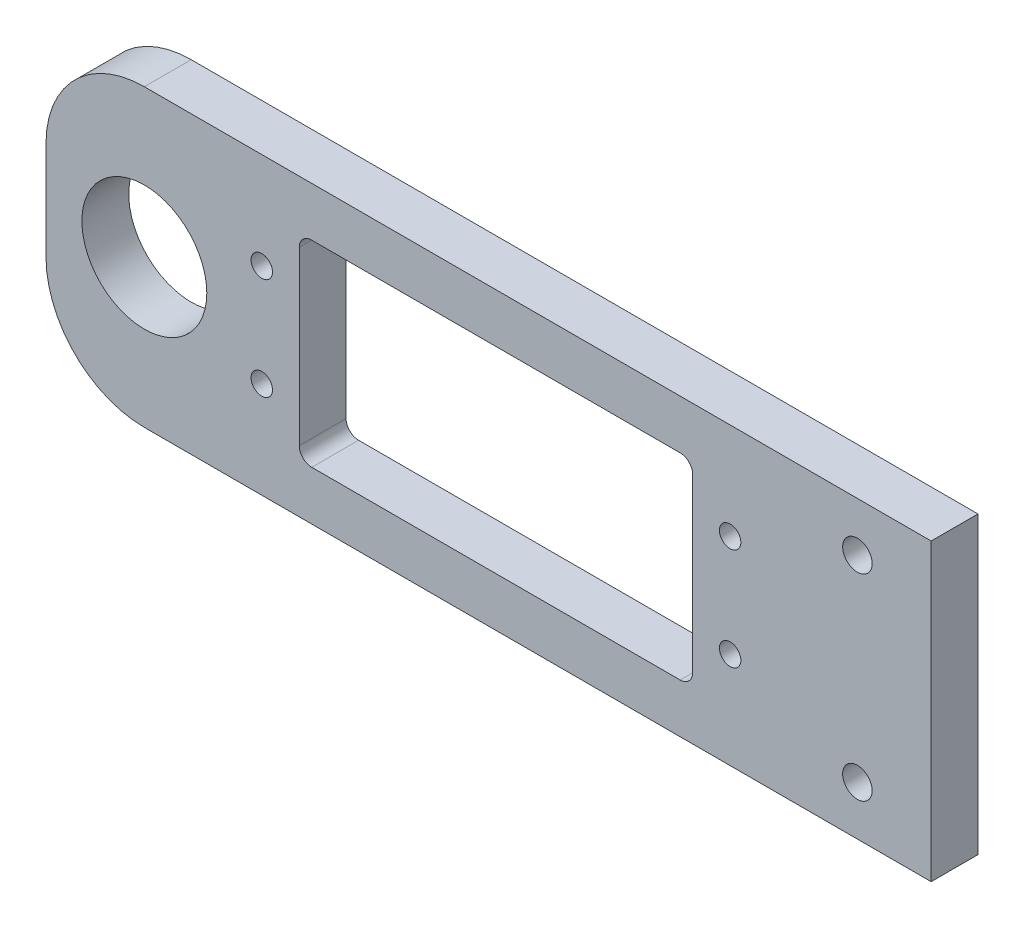
ISO-10303-21;
HEADER;
FILE_DESCRIPTION(('STEP AP214'),'2;1');
FILE_NAME('part.step','',(''),(''),'','','');
FILE_SCHEMA(('AUTOMOTIVE_DESIGN { 1 0 10303 214 1 1 1 1 }'));
ENDSEC;
DATA;
#1=APPLICATION_CONTEXT('core data for automotive mechanical design processes');
#2=APPLICATION_PROTOCOL_DEFINITION('international standard','automotive_design',2000,#1);
#3=PRODUCT_CONTEXT('',#1,'mechanical');
#4=PRODUCT('Part','Part','',(#3));
#5=PRODUCT_RELATED_PRODUCT_CATEGORY('part','',(#4));
#6=PRODUCT_DEFINITION_FORMATION('','',#4);
#7=PRODUCT_DEFINITION_CONTEXT('part definition',#1,'design');
#8=PRODUCT_DEFINITION('design','',#6,#7);
#9=PRODUCT_DEFINITION_SHAPE('','',#8);
#10=(LENGTH_UNIT() NAMED_UNIT(*) SI_UNIT(.MILLI.,.METRE.));
#11=(NAMED_UNIT(*) PLANE_ANGLE_UNIT() SI_UNIT($,.RADIAN.));
#12=(NAMED_UNIT(*) SI_UNIT($,.STERADIAN.) SOLID_ANGLE_UNIT());
#13=UNCERTAINTY_MEASURE_WITH_UNIT(LENGTH_MEASURE(1.E-05),#10,'distance_accuracy_value','');
#14=(GEOMETRIC_REPRESENTATION_CONTEXT(3) GLOBAL_UNCERTAINTY_ASSIGNED_CONTEXT((#13)) GLOBAL_UNIT_ASSIGNED_CONTEXT((#10,
#11,#12)) REPRESENTATION_CONTEXT('',''));
#15=CARTESIAN_POINT('',(0.,0.,0.));
#16=DIRECTION('',(0.,0.,1.));
#17=DIRECTION('',(1.,0.,0.));
#18=AXIS2_PLACEMENT_3D('',#15,#16,#17);
#19=CARTESIAN_POINT('',(45.,15.,4.7625));
#20=DIRECTION('',(-1.,0.,0.));
#21=DIRECTION('',(0.,-1.,0.));
#22=AXIS2_PLACEMENT_3D('',#19,#20,#21);
#23=PLANE('',#22);
#24=DIRECTION('',(0.,1.,0.));
#25=VECTOR('',#24,1.);
#26=CARTESIAN_POINT('',(45.,15.,0.));
#27=LINE('',#26,#25);
#28=CARTESIAN_POINT('',(45.,-15.,0.));
#29=VERTEX_POINT('',#28);
#30=CARTESIAN_POINT('',(45.,15.,0.));
#31=VERTEX_POINT('',#30);
#32=EDGE_CURVE('E159',#29,#31,#27,.T.);
#33=ORIENTED_EDGE('',*,*,#32,.T.);
#34=DIRECTION('',(0.,0.,-1.));
#35=VECTOR('',#34,1.);
#36=CARTESIAN_POINT('',(45.,15.,4.7625));
#37=LINE('',#36,#35);
#38=CARTESIAN_POINT('',(45.,15.,4.7625));
#39=VERTEX_POINT('',#38);
#40=EDGE_CURVE('E139',#39,#31,#37,.T.);
#41=ORIENTED_EDGE('',*,*,#40,.F.);
#42=DIRECTION('',(0.,1.,0.));
#43=VECTOR('',#42,1.);
#44=CARTESIAN_POINT('',(45.,15.,4.7625));
#45=LINE('',#44,#43);
#46=CARTESIAN_POINT('',(45.,-15.,4.7625));
#47=VERTEX_POINT('',#46);
#48=EDGE_CURVE('E146',#47,#39,#45,.T.);
#49=ORIENTED_EDGE('',*,*,#48,.F.);
#50=DIRECTION('',(0.,0.,-1.));
#51=VECTOR('',#50,1.);
#52=CARTESIAN_POINT('',(45.,-15.,4.7625));
#53=LINE('',#52,#51);
#54=EDGE_CURVE('E161',#47,#29,#53,.T.);
#55=ORIENTED_EDGE('',*,*,#54,.T.);
#56=EDGE_LOOP('',(#33,#41,#49,#55));
#57=FACE_BOUND('',#56,.T.);
#58=ADVANCED_FACE('F33',(#57),#23,.F.);
#59=CARTESIAN_POINT('',(-45.,15.,4.7625));
#60=DIRECTION('',(0.,-1.,0.));
#61=DIRECTION('',(0.,0.,-1.));
#62=AXIS2_PLACEMENT_3D('',#59,#60,#61);
#63=PLANE('',#62);
#64=DIRECTION('',(-1.,0.,0.));
#65=VECTOR('',#64,1.);
#66=CARTESIAN_POINT('',(-45.,15.,0.));
#67=LINE('',#66,#65);
#68=CARTESIAN_POINT('',(-35.,15.,0.));
#69=VERTEX_POINT('',#68);
#70=EDGE_CURVE('E304',#31,#69,#67,.T.);
#71=ORIENTED_EDGE('',*,*,#70,.T.);
#72=DIRECTION('',(0.,0.,-1.));
#73=VECTOR('',#72,1.);
#74=CARTESIAN_POINT('',(-35.,15.,4.7625));
#75=LINE('',#74,#73);
#76=CARTESIAN_POINT('',(-35.,15.,4.7625));
#77=VERTEX_POINT('',#76);
#78=EDGE_CURVE('E142',#69,#77,#75,.F.);
#79=ORIENTED_EDGE('',*,*,#78,.T.);
#80=DIRECTION('',(-1.,0.,0.));
#81=VECTOR('',#80,1.);
#82=CARTESIAN_POINT('',(-45.,15.,4.7625));
#83=LINE('',#82,#81);
#84=EDGE_CURVE('E134',#39,#77,#83,.T.);
#85=ORIENTED_EDGE('',*,*,#84,.F.);
#86=ORIENTED_EDGE('',*,*,#40,.T.);
#87=EDGE_LOOP('',(#71,#79,#85,#86));
#88=FACE_BOUND('',#87,.T.);
#89=ADVANCED_FACE('F137',(#88),#63,.F.);
#90=CARTESIAN_POINT('',(-45.,15.,4.7625));
#91=DIRECTION('',(1.,0.,0.));
#92=DIRECTION('',(0.,0.,-1.));
#93=AXIS2_PLACEMENT_3D('',#90,#91,#92);
#94=PLANE('',#93);
#95=DIRECTION('',(0.,-1.,0.));
#96=VECTOR('',#95,1.);
#97=CARTESIAN_POINT('',(-45.,15.,0.));
#98=LINE('',#97,#96);
#99=CARTESIAN_POINT('',(-45.,5.,0.));
#100=VERTEX_POINT('',#99);
#101=CARTESIAN_POINT('',(-45.,-5.,0.));
#102=VERTEX_POINT('',#101);
#103=EDGE_CURVE('E306',#100,#102,#98,.T.);
#104=ORIENTED_EDGE('',*,*,#103,.T.);
#105=DIRECTION('',(0.,0.,-1.));
#106=VECTOR('',#105,1.);
#107=CARTESIAN_POINT('',(-45.,-5.,4.7625));
#108=LINE('',#107,#106);
#109=CARTESIAN_POINT('',(-45.,-5.,4.7625));
#110=VERTEX_POINT('',#109);
#111=EDGE_CURVE('E175',#102,#110,#108,.F.);
#112=ORIENTED_EDGE('',*,*,#111,.T.);
#113=DIRECTION('',(0.,-1.,0.));
#114=VECTOR('',#113,1.);
#115=CARTESIAN_POINT('',(-45.,15.,4.7625));
#116=LINE('',#115,#114);
#117=CARTESIAN_POINT('',(-45.,5.,4.7625));
#118=VERTEX_POINT('',#117);
#119=EDGE_CURVE('E145',#118,#110,#116,.T.);
#120=ORIENTED_EDGE('',*,*,#119,.F.);
#121=DIRECTION('',(0.,0.,-1.));
#122=VECTOR('',#121,1.);
#123=CARTESIAN_POINT('',(-45.,5.,4.7625));
#124=LINE('',#123,#122);
#125=EDGE_CURVE('E172',#118,#100,#124,.T.);
#126=ORIENTED_EDGE('',*,*,#125,.T.);
#127=EDGE_LOOP('',(#104,#112,#120,#126));
#128=FACE_BOUND('',#127,.T.);
#129=ADVANCED_FACE('F248',(#128),#94,.F.);
#130=CARTESIAN_POINT('',(-45.,-15.,4.7625));
#131=DIRECTION('',(0.,1.,0.));
#132=DIRECTION('',(0.,0.,1.));
#133=AXIS2_PLACEMENT_3D('',#130,#131,#132);
#134=PLANE('',#133);
#135=DIRECTION('',(1.,0.,0.));
#136=VECTOR('',#135,1.);
#137=CARTESIAN_POINT('',(-45.,-15.,4.7625));
#138=LINE('',#137,#136);
#139=CARTESIAN_POINT('',(-35.,-15.,4.7625));
#140=VERTEX_POINT('',#139);
#141=EDGE_CURVE('E152',#140,#47,#138,.T.);
#142=ORIENTED_EDGE('',*,*,#141,.F.);
#143=DIRECTION('',(0.,0.,-1.));
#144=VECTOR('',#143,1.);
#145=CARTESIAN_POINT('',(-35.,-15.,4.7625));
#146=LINE('',#145,#144);
#147=CARTESIAN_POINT('',(-35.,-15.,0.));
#148=VERTEX_POINT('',#147);
#149=EDGE_CURVE('E160',#140,#148,#146,.T.);
#150=ORIENTED_EDGE('',*,*,#149,.T.);
#151=DIRECTION('',(1.,0.,0.));
#152=VECTOR('',#151,1.);
#153=CARTESIAN_POINT('',(-45.,-15.,0.));
#154=LINE('',#153,#152);
#155=EDGE_CURVE('E156',#148,#29,#154,.T.);
#156=ORIENTED_EDGE('',*,*,#155,.T.);
#157=ORIENTED_EDGE('',*,*,#54,.F.);
#158=EDGE_LOOP('',(#142,#150,#156,#157));
#159=FACE_BOUND('',#158,.T.);
#160=ADVANCED_FACE('F310',(#159),#134,.F.);
#161=CARTESIAN_POINT('',(0.,0.,4.7625));
#162=DIRECTION('',(0.,0.,1.));
#163=DIRECTION('',(1.,0.,0.));
#164=AXIS2_PLACEMENT_3D('',#161,#162,#163);
#165=PLANE('',#164);
#166=CARTESIAN_POINT('',(37.5,10.,4.7625));
#167=DIRECTION('',(0.,0.,1.));
#168=DIRECTION('',(1.,0.,0.));
#169=AXIS2_PLACEMENT_3D('',#166,#167,#168);
#170=CIRCLE('',#169,1.5);
#171=CARTESIAN_POINT('',(39.,10.,4.7625));
#172=VERTEX_POINT('',#171);
#173=EDGE_CURVE('E369',#172,#172,#170,.T.);
#174=ORIENTED_EDGE('',*,*,#173,.F.);
#175=EDGE_LOOP('',(#174));
#176=FACE_BOUND('',#175,.T.);
#177=CARTESIAN_POINT('',(37.5,-10.,4.7625));
#178=DIRECTION('',(0.,0.,1.));
#179=DIRECTION('',(-1.,0.,0.));
#180=AXIS2_PLACEMENT_3D('',#177,#178,#179);
#181=CIRCLE('',#180,1.5);
#182=CARTESIAN_POINT('',(36.,-10.,4.7625));
#183=VERTEX_POINT('',#182);
#184=EDGE_CURVE('E381',#183,#183,#181,.T.);
#185=ORIENTED_EDGE('',*,*,#184,.F.);
#186=EDGE_LOOP('',(#185));
#187=FACE_BOUND('',#186,.T.);
#188=CARTESIAN_POINT('',(24.56,5.19000000000001,4.7625));
#189=DIRECTION('',(0.,0.,1.));
#190=DIRECTION('',(-1.,0.,0.));
#191=AXIS2_PLACEMENT_3D('',#188,#189,#190);
#192=CIRCLE('',#191,1.09);
#193=CARTESIAN_POINT('',(23.47,5.19000000000001,4.7625));
#194=VERTEX_POINT('',#193);
#195=EDGE_CURVE('E373',#194,#194,#192,.T.);
#196=ORIENTED_EDGE('',*,*,#195,.F.);
#197=EDGE_LOOP('',(#196));
#198=FACE_BOUND('',#197,.T.);
#199=CARTESIAN_POINT('',(24.56,-5.19,4.7625));
#200=DIRECTION('',(0.,0.,1.));
#201=DIRECTION('',(1.,0.,0.));
#202=AXIS2_PLACEMENT_3D('',#199,#200,#201);
#203=CIRCLE('',#202,1.09);
#204=CARTESIAN_POINT('',(25.65,-5.19,4.7625));
#205=VERTEX_POINT('',#204);
#206=EDGE_CURVE('E393',#205,#205,#203,.T.);
#207=ORIENTED_EDGE('',*,*,#206,.F.);
#208=EDGE_LOOP('',(#207));
#209=FACE_BOUND('',#208,.T.);
#210=CARTESIAN_POINT('',(-23.06,-5.19,4.7625));
#211=DIRECTION('',(0.,0.,1.));
#212=DIRECTION('',(-1.,0.,0.));
#213=AXIS2_PLACEMENT_3D('',#210,#211,#212);
#214=CIRCLE('',#213,1.09);
#215=CARTESIAN_POINT('',(-24.15,-5.19,4.7625));
#216=VERTEX_POINT('',#215);
#217=EDGE_CURVE('E386',#216,#216,#214,.T.);
#218=ORIENTED_EDGE('',*,*,#217,.F.);
#219=EDGE_LOOP('',(#218));
#220=FACE_BOUND('',#219,.T.);
#221=CARTESIAN_POINT('',(-23.06,5.19,4.7625));
#222=DIRECTION('',(0.,0.,1.));
#223=DIRECTION('',(1.,0.,0.));
#224=AXIS2_PLACEMENT_3D('',#221,#222,#223);
#225=CIRCLE('',#224,1.09);
#226=CARTESIAN_POINT('',(-21.97,5.19,4.7625));
#227=VERTEX_POINT('',#226);
#228=EDGE_CURVE('E282',#227,#227,#225,.T.);
#229=ORIENTED_EDGE('',*,*,#228,.F.);
#230=EDGE_LOOP('',(#229));
#231=FACE_BOUND('',#230,.T.);
#232=DIRECTION('',(0.,-1.,0.));
#233=VECTOR('',#232,1.);
#234=CARTESIAN_POINT('',(-19.25,10.,4.7625));
#235=LINE('',#234,#233);
#236=CARTESIAN_POINT('',(-19.25,8.73,4.7625));
#237=VERTEX_POINT('',#236);
#238=CARTESIAN_POINT('',(-19.25,-8.73,4.7625));
#239=VERTEX_POINT('',#238);
#240=EDGE_CURVE('E288',#237,#239,#235,.T.);
#241=ORIENTED_EDGE('',*,*,#240,.F.);
#242=CARTESIAN_POINT('',(-17.98,8.73,4.7625));
#243=DIRECTION('',(0.,0.,1.));
#244=DIRECTION('',(1.,0.,0.));
#245=AXIS2_PLACEMENT_3D('',#242,#243,#244);
#246=CIRCLE('',#245,1.27);
#247=CARTESIAN_POINT('',(-17.98,10.,4.7625));
#248=VERTEX_POINT('',#247);
#249=EDGE_CURVE('E41',#237,#248,#246,.F.);
#250=ORIENTED_EDGE('',*,*,#249,.T.);
#251=DIRECTION('',(-1.,0.,0.));
#252=VECTOR('',#251,1.);
#253=CARTESIAN_POINT('',(-19.25,10.,4.7625));
#254=LINE('',#253,#252);
#255=CARTESIAN_POINT('',(19.48,10.,4.7625));
#256=VERTEX_POINT('',#255);
#257=EDGE_CURVE('E296',#256,#248,#254,.T.);
#258=ORIENTED_EDGE('',*,*,#257,.F.);
#259=CARTESIAN_POINT('',(19.48,8.73,4.7625));
#260=DIRECTION('',(0.,0.,1.));
#261=DIRECTION('',(1.,0.,0.));
#262=AXIS2_PLACEMENT_3D('',#259,#260,#261);
#263=CIRCLE('',#262,1.27);
#264=CARTESIAN_POINT('',(20.75,8.73,4.7625));
#265=VERTEX_POINT('',#264);
#266=EDGE_CURVE('E55',#256,#265,#263,.F.);
#267=ORIENTED_EDGE('',*,*,#266,.T.);
#268=DIRECTION('',(0.,1.,0.));
#269=VECTOR('',#268,1.);
#270=CARTESIAN_POINT('',(20.75,10.,4.7625));
#271=LINE('',#270,#269);
#272=CARTESIAN_POINT('',(20.75,-8.73,4.7625));
#273=VERTEX_POINT('',#272);
#274=EDGE_CURVE('E294',#273,#265,#271,.T.);
#275=ORIENTED_EDGE('',*,*,#274,.F.);
#276=CARTESIAN_POINT('',(19.48,-8.73,4.7625));
#277=DIRECTION('',(0.,0.,1.));
#278=DIRECTION('',(1.,0.,0.));
#279=AXIS2_PLACEMENT_3D('',#276,#277,#278);
#280=CIRCLE('',#279,1.27);
#281=CARTESIAN_POINT('',(19.48,-10.,4.7625));
#282=VERTEX_POINT('',#281);
#283=EDGE_CURVE('E205',#273,#282,#280,.F.);
#284=ORIENTED_EDGE('',*,*,#283,.T.);
#285=DIRECTION('',(1.,0.,0.));
#286=VECTOR('',#285,1.);
#287=CARTESIAN_POINT('',(-19.25,-10.,4.7625));
#288=LINE('',#287,#286);
#289=CARTESIAN_POINT('',(-17.98,-10.,4.7625));
#290=VERTEX_POINT('',#289);
#291=EDGE_CURVE('E291',#290,#282,#288,.T.);
#292=ORIENTED_EDGE('',*,*,#291,.F.);
#293=CARTESIAN_POINT('',(-17.98,-8.73,4.7625));
#294=DIRECTION('',(0.,0.,1.));
#295=DIRECTION('',(1.,0.,0.));
#296=AXIS2_PLACEMENT_3D('',#293,#294,#295);
#297=CIRCLE('',#296,1.27);
#298=EDGE_CURVE('E209',#290,#239,#297,.F.);
#299=ORIENTED_EDGE('',*,*,#298,.T.);
#300=EDGE_LOOP('',(#241,#250,#258,#267,#275,#284,#292,#299));
#301=FACE_BOUND('',#300,.T.);
#302=CARTESIAN_POINT('',(-35.,0.,4.7625));
#303=DIRECTION('',(0.,0.,1.));
#304=DIRECTION('',(1.,0.,0.));
#305=AXIS2_PLACEMENT_3D('',#302,#303,#304);
#306=CIRCLE('',#305,6.35);
#307=CARTESIAN_POINT('',(-28.65,0.,4.7625));
#308=VERTEX_POINT('',#307);
#309=EDGE_CURVE('E186',#308,#308,#306,.T.);
#310=ORIENTED_EDGE('',*,*,#309,.F.);
#311=EDGE_LOOP('',(#310));
#312=FACE_BOUND('',#311,.T.);
#313=ORIENTED_EDGE('',*,*,#119,.T.);
#314=CARTESIAN_POINT('',(-35.,-5.,4.7625));
#315=DIRECTION('',(0.,0.,1.));
#316=DIRECTION('',(1.,0.,0.));
#317=AXIS2_PLACEMENT_3D('',#314,#315,#316);
#318=CIRCLE('',#317,10.);
#319=EDGE_CURVE('E179',#110,#140,#318,.T.);
#320=ORIENTED_EDGE('',*,*,#319,.T.);
#321=ORIENTED_EDGE('',*,*,#141,.T.);
#322=ORIENTED_EDGE('',*,*,#48,.T.);
#323=ORIENTED_EDGE('',*,*,#84,.T.);
#324=CARTESIAN_POINT('',(-35.,5.,4.7625));
#325=DIRECTION('',(0.,0.,1.));
#326=DIRECTION('',(1.,0.,0.));
#327=AXIS2_PLACEMENT_3D('',#324,#325,#326);
#328=CIRCLE('',#327,10.);
#329=EDGE_CURVE('E177',#77,#118,#328,.T.);
#330=ORIENTED_EDGE('',*,*,#329,.T.);
#331=EDGE_LOOP('',(#313,#320,#321,#322,#323,#330));
#332=FACE_BOUND('',#331,.T.);
#333=ADVANCED_FACE('F150',(#176,#187,#198,#209,#220,#231,#301,#312,#332),#165,.T.);
#334=CARTESIAN_POINT('',(0.,0.,0.));
#335=DIRECTION('',(0.,0.,1.));
#336=DIRECTION('',(1.,0.,0.));
#337=AXIS2_PLACEMENT_3D('',#334,#335,#336);
#338=PLANE('',#337);
#339=CARTESIAN_POINT('',(37.5,10.,0.));
#340=DIRECTION('',(0.,0.,1.));
#341=DIRECTION('',(1.,0.,0.));
#342=AXIS2_PLACEMENT_3D('',#339,#340,#341);
#343=CIRCLE('',#342,1.5);
#344=CARTESIAN_POINT('',(39.,10.,0.));
#345=VERTEX_POINT('',#344);
#346=EDGE_CURVE('E372',#345,#345,#343,.F.);
#347=ORIENTED_EDGE('',*,*,#346,.F.);
#348=EDGE_LOOP('',(#347));
#349=FACE_BOUND('',#348,.T.);
#350=CARTESIAN_POINT('',(37.5,-10.,0.));
#351=DIRECTION('',(0.,0.,1.));
#352=DIRECTION('',(1.,0.,0.));
#353=AXIS2_PLACEMENT_3D('',#350,#351,#352);
#354=CIRCLE('',#353,1.5);
#355=CARTESIAN_POINT('',(39.,-10.,0.));
#356=VERTEX_POINT('',#355);
#357=EDGE_CURVE('E378',#356,#356,#354,.F.);
#358=ORIENTED_EDGE('',*,*,#357,.F.);
#359=EDGE_LOOP('',(#358));
#360=FACE_BOUND('',#359,.T.);
#361=CARTESIAN_POINT('',(24.56,5.19000000000001,0.));
#362=DIRECTION('',(0.,0.,1.));
#363=DIRECTION('',(1.,0.,0.));
#364=AXIS2_PLACEMENT_3D('',#361,#362,#363);
#365=CIRCLE('',#364,1.09);
#366=CARTESIAN_POINT('',(25.65,5.19000000000001,0.));
#367=VERTEX_POINT('',#366);
#368=EDGE_CURVE('E376',#367,#367,#365,.F.);
#369=ORIENTED_EDGE('',*,*,#368,.F.);
#370=EDGE_LOOP('',(#369));
#371=FACE_BOUND('',#370,.T.);
#372=CARTESIAN_POINT('',(24.56,-5.19,0.));
#373=DIRECTION('',(0.,0.,1.));
#374=DIRECTION('',(1.,0.,0.));
#375=AXIS2_PLACEMENT_3D('',#372,#373,#374);
#376=CIRCLE('',#375,1.09);
#377=CARTESIAN_POINT('',(25.65,-5.19,0.));
#378=VERTEX_POINT('',#377);
#379=EDGE_CURVE('E390',#378,#378,#376,.F.);
#380=ORIENTED_EDGE('',*,*,#379,.F.);
#381=EDGE_LOOP('',(#380));
#382=FACE_BOUND('',#381,.T.);
#383=CARTESIAN_POINT('',(-23.06,-5.19,0.));
#384=DIRECTION('',(0.,0.,1.));
#385=DIRECTION('',(1.,0.,0.));
#386=AXIS2_PLACEMENT_3D('',#383,#384,#385);
#387=CIRCLE('',#386,1.09);
#388=CARTESIAN_POINT('',(-21.97,-5.19,0.));
#389=VERTEX_POINT('',#388);
#390=EDGE_CURVE('E389',#389,#389,#387,.F.);
#391=ORIENTED_EDGE('',*,*,#390,.F.);
#392=EDGE_LOOP('',(#391));
#393=FACE_BOUND('',#392,.T.);
#394=CARTESIAN_POINT('',(-23.06,5.19,0.));
#395=DIRECTION('',(0.,0.,1.));
#396=DIRECTION('',(1.,0.,0.));
#397=AXIS2_PLACEMENT_3D('',#394,#395,#396);
#398=CIRCLE('',#397,1.09);
#399=CARTESIAN_POINT('',(-21.97,5.19,0.));
#400=VERTEX_POINT('',#399);
#401=EDGE_CURVE('E279',#400,#400,#398,.F.);
#402=ORIENTED_EDGE('',*,*,#401,.F.);
#403=EDGE_LOOP('',(#402));
#404=FACE_BOUND('',#403,.T.);
#405=DIRECTION('',(1.,0.,0.));
#406=VECTOR('',#405,1.);
#407=CARTESIAN_POINT('',(-19.25,10.,0.));
#408=LINE('',#407,#406);
#409=CARTESIAN_POINT('',(-17.98,10.,0.));
#410=VERTEX_POINT('',#409);
#411=CARTESIAN_POINT('',(19.48,10.,0.));
#412=VERTEX_POINT('',#411);
#413=EDGE_CURVE('E222',#410,#412,#408,.T.);
#414=ORIENTED_EDGE('',*,*,#413,.F.);
#415=CARTESIAN_POINT('',(-17.98,8.73,0.));
#416=DIRECTION('',(0.,0.,1.));
#417=DIRECTION('',(1.,0.,0.));
#418=AXIS2_PLACEMENT_3D('',#415,#416,#417);
#419=CIRCLE('',#418,1.27);
#420=CARTESIAN_POINT('',(-19.25,8.73,0.));
#421=VERTEX_POINT('',#420);
#422=EDGE_CURVE('E11',#410,#421,#419,.T.);
#423=ORIENTED_EDGE('',*,*,#422,.T.);
#424=DIRECTION('',(0.,1.,0.));
#425=VECTOR('',#424,1.);
#426=CARTESIAN_POINT('',(-19.25,10.,0.));
#427=LINE('',#426,#425);
#428=CARTESIAN_POINT('',(-19.25,-8.73,0.));
#429=VERTEX_POINT('',#428);
#430=EDGE_CURVE('E229',#429,#421,#427,.T.);
#431=ORIENTED_EDGE('',*,*,#430,.F.);
#432=CARTESIAN_POINT('',(-17.98,-8.73,0.));
#433=DIRECTION('',(0.,0.,1.));
#434=DIRECTION('',(1.,0.,0.));
#435=AXIS2_PLACEMENT_3D('',#432,#433,#434);
#436=CIRCLE('',#435,1.27);
#437=CARTESIAN_POINT('',(-17.98,-10.,0.));
#438=VERTEX_POINT('',#437);
#439=EDGE_CURVE('E211',#429,#438,#436,.T.);
#440=ORIENTED_EDGE('',*,*,#439,.T.);
#441=DIRECTION('',(-1.,0.,0.));
#442=VECTOR('',#441,1.);
#443=CARTESIAN_POINT('',(-19.25,-10.,0.));
#444=LINE('',#443,#442);
#445=CARTESIAN_POINT('',(19.48,-10.,0.));
#446=VERTEX_POINT('',#445);
#447=EDGE_CURVE('E275',#446,#438,#444,.T.);
#448=ORIENTED_EDGE('',*,*,#447,.F.);
#449=CARTESIAN_POINT('',(19.48,-8.73,0.));
#450=DIRECTION('',(0.,0.,1.));
#451=DIRECTION('',(1.,0.,0.));
#452=AXIS2_PLACEMENT_3D('',#449,#450,#451);
#453=CIRCLE('',#452,1.27);
#454=CARTESIAN_POINT('',(20.75,-8.73,0.));
#455=VERTEX_POINT('',#454);
#456=EDGE_CURVE('E207',#446,#455,#453,.T.);
#457=ORIENTED_EDGE('',*,*,#456,.T.);
#458=DIRECTION('',(0.,-1.,0.));
#459=VECTOR('',#458,1.);
#460=CARTESIAN_POINT('',(20.75,10.,0.));
#461=LINE('',#460,#459);
#462=CARTESIAN_POINT('',(20.75,8.73,0.));
#463=VERTEX_POINT('',#462);
#464=EDGE_CURVE('E225',#463,#455,#461,.T.);
#465=ORIENTED_EDGE('',*,*,#464,.F.);
#466=CARTESIAN_POINT('',(19.48,8.73,0.));
#467=DIRECTION('',(0.,0.,1.));
#468=DIRECTION('',(1.,0.,0.));
#469=AXIS2_PLACEMENT_3D('',#466,#467,#468);
#470=CIRCLE('',#469,1.27);
#471=EDGE_CURVE('E214',#463,#412,#470,.T.);
#472=ORIENTED_EDGE('',*,*,#471,.T.);
#473=EDGE_LOOP('',(#414,#423,#431,#440,#448,#457,#465,#472));
#474=FACE_BOUND('',#473,.T.);
#475=CARTESIAN_POINT('',(-35.,0.,0.));
#476=DIRECTION('',(0.,0.,1.));
#477=DIRECTION('',(1.,0.,0.));
#478=AXIS2_PLACEMENT_3D('',#475,#476,#477);
#479=CIRCLE('',#478,6.35);
#480=CARTESIAN_POINT('',(-28.65,0.,0.));
#481=VERTEX_POINT('',#480);
#482=EDGE_CURVE('E183',#481,#481,#479,.T.);
#483=ORIENTED_EDGE('',*,*,#482,.T.);
#484=EDGE_LOOP('',(#483));
#485=FACE_BOUND('',#484,.T.);
#486=ORIENTED_EDGE('',*,*,#155,.F.);
#487=CARTESIAN_POINT('',(-35.,-5.,0.));
#488=DIRECTION('',(0.,0.,1.));
#489=DIRECTION('',(1.,0.,0.));
#490=AXIS2_PLACEMENT_3D('',#487,#488,#489);
#491=CIRCLE('',#490,10.);
#492=EDGE_CURVE('E170',#148,#102,#491,.F.);
#493=ORIENTED_EDGE('',*,*,#492,.T.);
#494=ORIENTED_EDGE('',*,*,#103,.F.);
#495=CARTESIAN_POINT('',(-35.,5.,0.));
#496=DIRECTION('',(0.,0.,1.));
#497=DIRECTION('',(1.,0.,0.));
#498=AXIS2_PLACEMENT_3D('',#495,#496,#497);
#499=CIRCLE('',#498,10.);
#500=EDGE_CURVE('E164',#100,#69,#499,.F.);
#501=ORIENTED_EDGE('',*,*,#500,.T.);
#502=ORIENTED_EDGE('',*,*,#70,.F.);
#503=ORIENTED_EDGE('',*,*,#32,.F.);
#504=EDGE_LOOP('',(#486,#493,#494,#501,#502,#503));
#505=FACE_BOUND('',#504,.T.);
#506=ADVANCED_FACE('F220',(#349,#360,#371,#382,#393,#404,#474,#485,#505),#338,.F.);
#507=CARTESIAN_POINT('',(-35.,-5.,4.7625));
#508=DIRECTION('',(0.,0.,-1.));
#509=DIRECTION('',(-1.,0.,0.));
#510=AXIS2_PLACEMENT_3D('',#507,#508,#509);
#511=CYLINDRICAL_SURFACE('',#510,10.);
#512=ORIENTED_EDGE('',*,*,#319,.F.);
#513=ORIENTED_EDGE('',*,*,#111,.F.);
#514=ORIENTED_EDGE('',*,*,#492,.F.);
#515=ORIENTED_EDGE('',*,*,#149,.F.);
#516=EDGE_LOOP('',(#512,#513,#514,#515));
#517=FACE_BOUND('',#516,.T.);
#518=ADVANCED_FACE('F252',(#517),#511,.T.);
#519=CARTESIAN_POINT('',(-35.,5.,4.7625));
#520=DIRECTION('',(0.,0.,-1.));
#521=DIRECTION('',(-1.,0.,0.));
#522=AXIS2_PLACEMENT_3D('',#519,#520,#521);
#523=CYLINDRICAL_SURFACE('',#522,10.);
#524=ORIENTED_EDGE('',*,*,#329,.F.);
#525=ORIENTED_EDGE('',*,*,#78,.F.);
#526=ORIENTED_EDGE('',*,*,#500,.F.);
#527=ORIENTED_EDGE('',*,*,#125,.F.);
#528=EDGE_LOOP('',(#524,#525,#526,#527));
#529=FACE_BOUND('',#528,.T.);
#530=ADVANCED_FACE('F255',(#529),#523,.T.);
#531=CARTESIAN_POINT('',(-35.,0.,-1.2375));
#532=DIRECTION('',(0.,0.,1.));
#533=DIRECTION('',(1.,0.,0.));
#534=AXIS2_PLACEMENT_3D('',#531,#532,#533);
#535=CYLINDRICAL_SURFACE('',#534,6.35);
#536=ORIENTED_EDGE('',*,*,#309,.T.);
#537=EDGE_LOOP('',(#536));
#538=FACE_BOUND('',#537,.T.);
#539=ORIENTED_EDGE('',*,*,#482,.F.);
#540=EDGE_LOOP('',(#539));
#541=FACE_BOUND('',#540,.T.);
#542=ADVANCED_FACE('F259',(#538,#541),#535,.F.);
#543=CARTESIAN_POINT('',(-19.25,10.,-0.00100000000000013));
#544=DIRECTION('',(-1.,0.,0.));
#545=DIRECTION('',(0.,0.,1.));
#546=AXIS2_PLACEMENT_3D('',#543,#544,#545);
#547=PLANE('',#546);
#548=ORIENTED_EDGE('',*,*,#240,.T.);
#549=DIRECTION('',(0.,0.,1.));
#550=VECTOR('',#549,1.);
#551=CARTESIAN_POINT('',(-19.25,-8.73,0.));
#552=LINE('',#551,#550);
#553=EDGE_CURVE('E199',#239,#429,#552,.F.);
#554=ORIENTED_EDGE('',*,*,#553,.T.);
#555=ORIENTED_EDGE('',*,*,#430,.T.);
#556=DIRECTION('',(0.,0.,1.));
#557=VECTOR('',#556,1.);
#558=CARTESIAN_POINT('',(-19.25,8.73,4.7625));
#559=LINE('',#558,#557);
#560=EDGE_CURVE('E196',#421,#237,#559,.T.);
#561=ORIENTED_EDGE('',*,*,#560,.T.);
#562=EDGE_LOOP('',(#548,#554,#555,#561));
#563=FACE_BOUND('',#562,.T.);
#564=ADVANCED_FACE('F333',(#563),#547,.F.);
#565=CARTESIAN_POINT('',(-19.25,10.,-0.00100000000000013));
#566=DIRECTION('',(0.,1.,0.));
#567=DIRECTION('',(-1.,0.,0.));
#568=AXIS2_PLACEMENT_3D('',#565,#566,#567);
#569=PLANE('',#568);
#570=ORIENTED_EDGE('',*,*,#413,.T.);
#571=DIRECTION('',(0.,0.,1.));
#572=VECTOR('',#571,1.);
#573=CARTESIAN_POINT('',(19.48,10.,4.7625));
#574=LINE('',#573,#572);
#575=EDGE_CURVE('E203',#412,#256,#574,.T.);
#576=ORIENTED_EDGE('',*,*,#575,.T.);
#577=ORIENTED_EDGE('',*,*,#257,.T.);
#578=DIRECTION('',(0.,0.,1.));
#579=VECTOR('',#578,1.);
#580=CARTESIAN_POINT('',(-17.98,10.,0.));
#581=LINE('',#580,#579);
#582=EDGE_CURVE('E201',#248,#410,#581,.F.);
#583=ORIENTED_EDGE('',*,*,#582,.T.);
#584=EDGE_LOOP('',(#570,#576,#577,#583));
#585=FACE_BOUND('',#584,.T.);
#586=ADVANCED_FACE('F227',(#585),#569,.F.);
#587=CARTESIAN_POINT('',(20.75,10.,-0.00100000000000013));
#588=DIRECTION('',(1.,0.,0.));
#589=DIRECTION('',(0.,1.,0.));
#590=AXIS2_PLACEMENT_3D('',#587,#588,#589);
#591=PLANE('',#590);
#592=ORIENTED_EDGE('',*,*,#464,.T.);
#593=DIRECTION('',(0.,0.,1.));
#594=VECTOR('',#593,1.);
#595=CARTESIAN_POINT('',(20.75,-8.73,4.7625));
#596=LINE('',#595,#594);
#597=EDGE_CURVE('E188',#455,#273,#596,.T.);
#598=ORIENTED_EDGE('',*,*,#597,.T.);
#599=ORIENTED_EDGE('',*,*,#274,.T.);
#600=DIRECTION('',(0.,0.,1.));
#601=VECTOR('',#600,1.);
#602=CARTESIAN_POINT('',(20.75,8.73,0.));
#603=LINE('',#602,#601);
#604=EDGE_CURVE('E182',#265,#463,#603,.F.);
#605=ORIENTED_EDGE('',*,*,#604,.T.);
#606=EDGE_LOOP('',(#592,#598,#599,#605));
#607=FACE_BOUND('',#606,.T.);
#608=ADVANCED_FACE('F267',(#607),#591,.F.);
#609=CARTESIAN_POINT('',(-19.25,-10.,-0.00100000000000013));
#610=DIRECTION('',(0.,-1.,0.));
#611=DIRECTION('',(0.,0.,-1.));
#612=AXIS2_PLACEMENT_3D('',#609,#610,#611);
#613=PLANE('',#612);
#614=ORIENTED_EDGE('',*,*,#291,.T.);
#615=DIRECTION('',(0.,0.,1.));
#616=VECTOR('',#615,1.);
#617=CARTESIAN_POINT('',(19.48,-10.,0.));
#618=LINE('',#617,#616);
#619=EDGE_CURVE('E194',#282,#446,#618,.F.);
#620=ORIENTED_EDGE('',*,*,#619,.T.);
#621=ORIENTED_EDGE('',*,*,#447,.T.);
#622=DIRECTION('',(0.,0.,1.));
#623=VECTOR('',#622,1.);
#624=CARTESIAN_POINT('',(-17.98,-10.,4.7625));
#625=LINE('',#624,#623);
#626=EDGE_CURVE('E191',#438,#290,#625,.T.);
#627=ORIENTED_EDGE('',*,*,#626,.T.);
#628=EDGE_LOOP('',(#614,#620,#621,#627));
#629=FACE_BOUND('',#628,.T.);
#630=ADVANCED_FACE('F262',(#629),#613,.F.);
#631=CARTESIAN_POINT('',(19.48,-8.73,-0.00100000000000013));
#632=DIRECTION('',(0.,0.,-1.));
#633=DIRECTION('',(-1.,0.,0.));
#634=AXIS2_PLACEMENT_3D('',#631,#632,#633);
#635=CYLINDRICAL_SURFACE('',#634,1.27);
#636=ORIENTED_EDGE('',*,*,#456,.F.);
#637=ORIENTED_EDGE('',*,*,#619,.F.);
#638=ORIENTED_EDGE('',*,*,#283,.F.);
#639=ORIENTED_EDGE('',*,*,#597,.F.);
#640=EDGE_LOOP('',(#636,#637,#638,#639));
#641=FACE_BOUND('',#640,.T.);
#642=ADVANCED_FACE('F240',(#641),#635,.F.);
#643=CARTESIAN_POINT('',(-17.98,-8.73,-0.00100000000000013));
#644=DIRECTION('',(0.,0.,-1.));
#645=DIRECTION('',(-1.,0.,0.));
#646=AXIS2_PLACEMENT_3D('',#643,#644,#645);
#647=CYLINDRICAL_SURFACE('',#646,1.27);
#648=ORIENTED_EDGE('',*,*,#439,.F.);
#649=ORIENTED_EDGE('',*,*,#553,.F.);
#650=ORIENTED_EDGE('',*,*,#298,.F.);
#651=ORIENTED_EDGE('',*,*,#626,.F.);
#652=EDGE_LOOP('',(#648,#649,#650,#651));
#653=FACE_BOUND('',#652,.T.);
#654=ADVANCED_FACE('F233',(#653),#647,.F.);
#655=CARTESIAN_POINT('',(19.48,8.73,-0.00100000000000013));
#656=DIRECTION('',(0.,0.,-1.));
#657=DIRECTION('',(-1.,0.,0.));
#658=AXIS2_PLACEMENT_3D('',#655,#656,#657);
#659=CYLINDRICAL_SURFACE('',#658,1.27);
#660=ORIENTED_EDGE('',*,*,#471,.F.);
#661=ORIENTED_EDGE('',*,*,#604,.F.);
#662=ORIENTED_EDGE('',*,*,#266,.F.);
#663=ORIENTED_EDGE('',*,*,#575,.F.);
#664=EDGE_LOOP('',(#660,#661,#662,#663));
#665=FACE_BOUND('',#664,.T.);
#666=ADVANCED_FACE('F231',(#665),#659,.F.);
#667=CARTESIAN_POINT('',(-17.98,8.73,-0.00100000000000013));
#668=DIRECTION('',(0.,0.,-1.));
#669=DIRECTION('',(-1.,0.,0.));
#670=AXIS2_PLACEMENT_3D('',#667,#668,#669);
#671=CYLINDRICAL_SURFACE('',#670,1.27);
#672=ORIENTED_EDGE('',*,*,#422,.F.);
#673=ORIENTED_EDGE('',*,*,#582,.F.);
#674=ORIENTED_EDGE('',*,*,#249,.F.);
#675=ORIENTED_EDGE('',*,*,#560,.F.);
#676=EDGE_LOOP('',(#672,#673,#674,#675));
#677=FACE_BOUND('',#676,.T.);
#678=ADVANCED_FACE('F35',(#677),#671,.F.);
#679=CARTESIAN_POINT('',(-23.06,5.19,-0.00100000000000013));
#680=DIRECTION('',(0.,0.,1.));
#681=DIRECTION('',(1.,0.,0.));
#682=AXIS2_PLACEMENT_3D('',#679,#680,#681);
#683=CYLINDRICAL_SURFACE('',#682,1.09);
#684=ORIENTED_EDGE('',*,*,#228,.T.);
#685=EDGE_LOOP('',(#684));
#686=FACE_BOUND('',#685,.T.);
#687=ORIENTED_EDGE('',*,*,#401,.T.);
#688=EDGE_LOOP('',(#687));
#689=FACE_BOUND('',#688,.T.);
#690=ADVANCED_FACE('F238',(#686,#689),#683,.F.);
#691=CARTESIAN_POINT('',(-23.06,-5.19,-0.00100000000000013));
#692=DIRECTION('',(0.,0.,1.));
#693=DIRECTION('',(1.,0.,0.));
#694=AXIS2_PLACEMENT_3D('',#691,#692,#693);
#695=CYLINDRICAL_SURFACE('',#694,1.09);
#696=ORIENTED_EDGE('',*,*,#217,.T.);
#697=EDGE_LOOP('',(#696));
#698=FACE_BOUND('',#697,.T.);
#699=ORIENTED_EDGE('',*,*,#390,.T.);
#700=EDGE_LOOP('',(#699));
#701=FACE_BOUND('',#700,.T.);
#702=ADVANCED_FACE('F344',(#698,#701),#695,.F.);
#703=CARTESIAN_POINT('',(24.56,-5.19,-0.00100000000000013));
#704=DIRECTION('',(0.,0.,1.));
#705=DIRECTION('',(1.,0.,0.));
#706=AXIS2_PLACEMENT_3D('',#703,#704,#705);
#707=CYLINDRICAL_SURFACE('',#706,1.09);
#708=ORIENTED_EDGE('',*,*,#206,.T.);
#709=EDGE_LOOP('',(#708));
#710=FACE_BOUND('',#709,.T.);
#711=ORIENTED_EDGE('',*,*,#379,.T.);
#712=EDGE_LOOP('',(#711));
#713=FACE_BOUND('',#712,.T.);
#714=ADVANCED_FACE('F350',(#710,#713),#707,.F.);
#715=CARTESIAN_POINT('',(24.56,5.19000000000001,-0.00100000000000013));
#716=DIRECTION('',(0.,0.,1.));
#717=DIRECTION('',(1.,0.,0.));
#718=AXIS2_PLACEMENT_3D('',#715,#716,#717);
#719=CYLINDRICAL_SURFACE('',#718,1.09);
#720=ORIENTED_EDGE('',*,*,#195,.T.);
#721=EDGE_LOOP('',(#720));
#722=FACE_BOUND('',#721,.T.);
#723=ORIENTED_EDGE('',*,*,#368,.T.);
#724=EDGE_LOOP('',(#723));
#725=FACE_BOUND('',#724,.T.);
#726=ADVANCED_FACE('F346',(#722,#725),#719,.F.);
#727=CARTESIAN_POINT('',(37.5,-10.,-0.00100000000000013));
#728=DIRECTION('',(0.,0.,1.));
#729=DIRECTION('',(1.,0.,0.));
#730=AXIS2_PLACEMENT_3D('',#727,#728,#729);
#731=CYLINDRICAL_SURFACE('',#730,1.5);
#732=ORIENTED_EDGE('',*,*,#184,.T.);
#733=EDGE_LOOP('',(#732));
#734=FACE_BOUND('',#733,.T.);
#735=ORIENTED_EDGE('',*,*,#357,.T.);
#736=EDGE_LOOP('',(#735));
#737=FACE_BOUND('',#736,.T.);
#738=ADVANCED_FACE('F349',(#734,#737),#731,.F.);
#739=CARTESIAN_POINT('',(37.5,10.,-0.00100000000000013));
#740=DIRECTION('',(0.,0.,1.));
#741=DIRECTION('',(1.,0.,0.));
#742=AXIS2_PLACEMENT_3D('',#739,#740,#741);
#743=CYLINDRICAL_SURFACE('',#742,1.5);
#744=ORIENTED_EDGE('',*,*,#173,.T.);
#745=EDGE_LOOP('',(#744));
#746=FACE_BOUND('',#745,.T.);
#747=ORIENTED_EDGE('',*,*,#346,.T.);
#748=EDGE_LOOP('',(#747));
#749=FACE_BOUND('',#748,.T.);
#750=ADVANCED_FACE('F360',(#746,#749),#743,.F.);
#751=CLOSED_SHELL('',(#58,#89,#129,#160,#333,#506,#518,#530,#542,#564,#586,#608,#630,#642,#654,
#666,#678,#690,#702,#714,#726,#738,#750));
#752=MANIFOLD_SOLID_BREP('B2',#751);
#753=ADVANCED_BREP_SHAPE_REPRESENTATION('',(#18,#752),#14);
#754=SHAPE_DEFINITION_REPRESENTATION(#9,#753);
ENDSEC;
END-ISO-10303-21;
